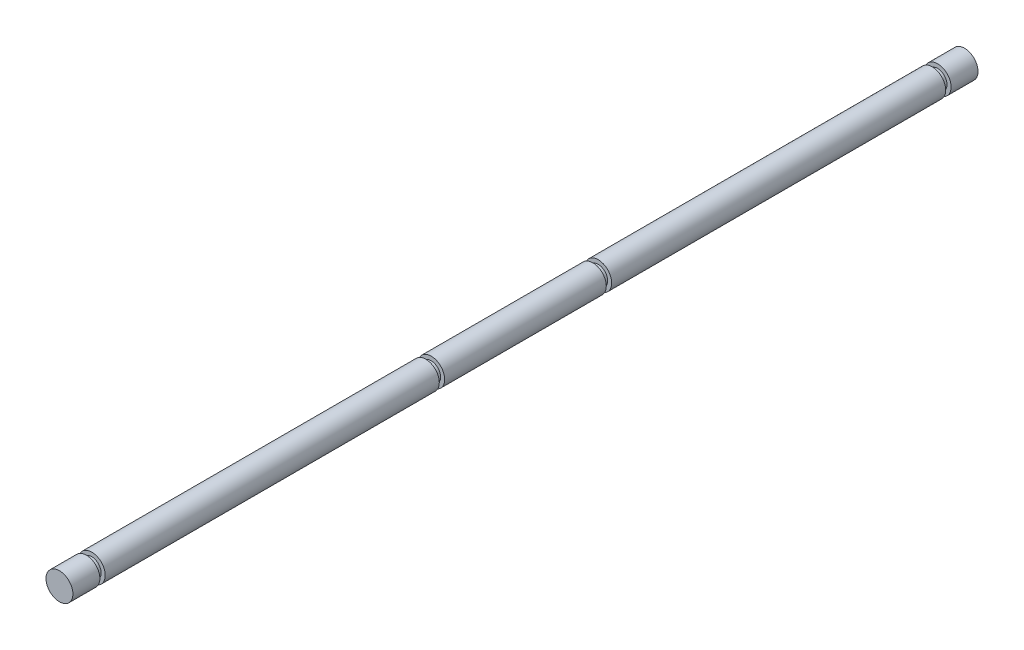
ISO-10303-21;
HEADER;
FILE_DESCRIPTION(('STEP AP214'),'2;1');
FILE_NAME('part.step','',(''),(''),'','','');
FILE_SCHEMA(('AUTOMOTIVE_DESIGN { 1 0 10303 214 1 1 1 1 }'));
ENDSEC;
DATA;
#1=APPLICATION_CONTEXT('core data for automotive mechanical design processes');
#2=APPLICATION_PROTOCOL_DEFINITION('international standard','automotive_design',2000,#1);
#3=PRODUCT_CONTEXT('',#1,'mechanical');
#4=PRODUCT('Part','Part','',(#3));
#5=PRODUCT_RELATED_PRODUCT_CATEGORY('part','',(#4));
#6=PRODUCT_DEFINITION_FORMATION('','',#4);
#7=PRODUCT_DEFINITION_CONTEXT('part definition',#1,'design');
#8=PRODUCT_DEFINITION('design','',#6,#7);
#9=PRODUCT_DEFINITION_SHAPE('','',#8);
#10=(LENGTH_UNIT() NAMED_UNIT(*) SI_UNIT(.MILLI.,.METRE.));
#11=(NAMED_UNIT(*) PLANE_ANGLE_UNIT() SI_UNIT($,.RADIAN.));
#12=(NAMED_UNIT(*) SI_UNIT($,.STERADIAN.) SOLID_ANGLE_UNIT());
#13=UNCERTAINTY_MEASURE_WITH_UNIT(LENGTH_MEASURE(1.E-05),#10,'distance_accuracy_value','');
#14=(GEOMETRIC_REPRESENTATION_CONTEXT(3) GLOBAL_UNCERTAINTY_ASSIGNED_CONTEXT((#13)) GLOBAL_UNIT_ASSIGNED_CONTEXT((#10,
#11,#12)) REPRESENTATION_CONTEXT('',''));
#15=CARTESIAN_POINT('',(0.,0.,0.));
#16=DIRECTION('',(0.,0.,1.));
#17=DIRECTION('',(1.,0.,0.));
#18=AXIS2_PLACEMENT_3D('',#15,#16,#17);
#19=CARTESIAN_POINT('',(0.,0.,60.));
#20=DIRECTION('',(0.,0.,-1.));
#21=DIRECTION('',(-1.,0.,0.));
#22=AXIS2_PLACEMENT_3D('',#19,#20,#21);
#23=CYLINDRICAL_SURFACE('',#22,5.);
#24=CARTESIAN_POINT('',(0.,0.,60.));
#25=DIRECTION('',(0.,0.,1.));
#26=DIRECTION('',(1.,0.,0.));
#27=AXIS2_PLACEMENT_3D('',#24,#25,#26);
#28=CIRCLE('',#27,5.);
#29=CARTESIAN_POINT('',(5.,0.,60.));
#30=VERTEX_POINT('',#29);
#31=EDGE_CURVE('E83',#30,#30,#28,.T.);
#32=ORIENTED_EDGE('',*,*,#31,.F.);
#33=EDGE_LOOP('',(#32));
#34=FACE_BOUND('',#33,.T.);
#35=CARTESIAN_POINT('',(0.,0.,0.));
#36=DIRECTION('',(0.,0.,1.));
#37=DIRECTION('',(1.,0.,0.));
#38=AXIS2_PLACEMENT_3D('',#35,#36,#37);
#39=CIRCLE('',#38,5.);
#40=CARTESIAN_POINT('',(5.,0.,0.));
#41=VERTEX_POINT('',#40);
#42=EDGE_CURVE('E37',#41,#41,#39,.T.);
#43=ORIENTED_EDGE('',*,*,#42,.T.);
#44=EDGE_LOOP('',(#43));
#45=FACE_BOUND('',#44,.T.);
#46=ADVANCED_FACE('F34',(#34,#45),#23,.T.);
#47=CARTESIAN_POINT('',(0.,0.,60.));
#48=DIRECTION('',(0.,0.,1.));
#49=DIRECTION('',(1.,0.,0.));
#50=AXIS2_PLACEMENT_3D('',#47,#48,#49);
#51=PLANE('',#50);
#52=CARTESIAN_POINT('',(0.,0.,60.));
#53=DIRECTION('',(0.,0.,1.));
#54=DIRECTION('',(1.,0.,0.));
#55=AXIS2_PLACEMENT_3D('',#52,#53,#54);
#56=CIRCLE('',#55,3.5);
#57=CARTESIAN_POINT('',(3.5,0.,60.));
#58=VERTEX_POINT('',#57);
#59=EDGE_CURVE('E79',#58,#58,#56,.T.);
#60=ORIENTED_EDGE('',*,*,#59,.F.);
#61=EDGE_LOOP('',(#60));
#62=FACE_BOUND('',#61,.T.);
#63=ORIENTED_EDGE('',*,*,#31,.T.);
#64=EDGE_LOOP('',(#63));
#65=FACE_BOUND('',#64,.T.);
#66=ADVANCED_FACE('F94',(#62,#65),#51,.T.);
#67=CARTESIAN_POINT('',(0.,0.,0.));
#68=DIRECTION('',(0.,0.,1.));
#69=DIRECTION('',(1.,0.,0.));
#70=AXIS2_PLACEMENT_3D('',#67,#68,#69);
#71=PLANE('',#70);
#72=CARTESIAN_POINT('',(0.,0.,0.));
#73=DIRECTION('',(0.,0.,-1.));
#74=DIRECTION('',(-1.,0.,0.));
#75=AXIS2_PLACEMENT_3D('',#72,#73,#74);
#76=CIRCLE('',#75,3.5);
#77=CARTESIAN_POINT('',(-3.5,0.,0.));
#78=VERTEX_POINT('',#77);
#79=EDGE_CURVE('E46',#78,#78,#76,.T.);
#80=ORIENTED_EDGE('',*,*,#79,.F.);
#81=EDGE_LOOP('',(#80));
#82=FACE_BOUND('',#81,.T.);
#83=ORIENTED_EDGE('',*,*,#42,.F.);
#84=EDGE_LOOP('',(#83));
#85=FACE_BOUND('',#84,.T.);
#86=ADVANCED_FACE('F91',(#82,#85),#71,.F.);
#87=CARTESIAN_POINT('',(0.,0.,62.));
#88=DIRECTION('',(0.,0.,-1.));
#89=DIRECTION('',(-1.,0.,0.));
#90=AXIS2_PLACEMENT_3D('',#87,#88,#89);
#91=CYLINDRICAL_SURFACE('',#90,3.5);
#92=CARTESIAN_POINT('',(0.,0.,62.));
#93=DIRECTION('',(0.,0.,1.));
#94=DIRECTION('',(1.,0.,0.));
#95=AXIS2_PLACEMENT_3D('',#92,#93,#94);
#96=CIRCLE('',#95,3.5);
#97=CARTESIAN_POINT('',(3.5,0.,62.));
#98=VERTEX_POINT('',#97);
#99=EDGE_CURVE('E76',#98,#98,#96,.T.);
#100=ORIENTED_EDGE('',*,*,#99,.F.);
#101=EDGE_LOOP('',(#100));
#102=FACE_BOUND('',#101,.T.);
#103=ORIENTED_EDGE('',*,*,#59,.T.);
#104=EDGE_LOOP('',(#103));
#105=FACE_BOUND('',#104,.T.);
#106=ADVANCED_FACE('F93',(#102,#105),#91,.T.);
#107=CARTESIAN_POINT('',(0.,0.,-2.));
#108=DIRECTION('',(0.,0.,1.));
#109=DIRECTION('',(1.,0.,0.));
#110=AXIS2_PLACEMENT_3D('',#107,#108,#109);
#111=CYLINDRICAL_SURFACE('',#110,3.5);
#112=CARTESIAN_POINT('',(0.,0.,-2.));
#113=DIRECTION('',(0.,0.,-1.));
#114=DIRECTION('',(-1.,0.,0.));
#115=AXIS2_PLACEMENT_3D('',#112,#113,#114);
#116=CIRCLE('',#115,3.5);
#117=CARTESIAN_POINT('',(-3.5,0.,-2.));
#118=VERTEX_POINT('',#117);
#119=EDGE_CURVE('E71',#118,#118,#116,.T.);
#120=ORIENTED_EDGE('',*,*,#119,.F.);
#121=EDGE_LOOP('',(#120));
#122=FACE_BOUND('',#121,.T.);
#123=ORIENTED_EDGE('',*,*,#79,.T.);
#124=EDGE_LOOP('',(#123));
#125=FACE_BOUND('',#124,.T.);
#126=ADVANCED_FACE('F100',(#122,#125),#111,.T.);
#127=CARTESIAN_POINT('',(0.,0.,-126.));
#128=DIRECTION('',(0.,0.,1.));
#129=DIRECTION('',(1.,0.,0.));
#130=AXIS2_PLACEMENT_3D('',#127,#128,#129);
#131=CYLINDRICAL_SURFACE('',#130,5.);
#132=CARTESIAN_POINT('',(0.,0.,-126.));
#133=DIRECTION('',(0.,0.,-1.));
#134=DIRECTION('',(-1.,0.,0.));
#135=AXIS2_PLACEMENT_3D('',#132,#133,#134);
#136=CIRCLE('',#135,5.);
#137=CARTESIAN_POINT('',(-5.,0.,-126.));
#138=VERTEX_POINT('',#137);
#139=EDGE_CURVE('E68',#138,#138,#136,.T.);
#140=ORIENTED_EDGE('',*,*,#139,.F.);
#141=EDGE_LOOP('',(#140));
#142=FACE_BOUND('',#141,.T.);
#143=CARTESIAN_POINT('',(0.,0.,-2.));
#144=DIRECTION('',(0.,0.,-1.));
#145=DIRECTION('',(-1.,0.,0.));
#146=AXIS2_PLACEMENT_3D('',#143,#144,#145);
#147=CIRCLE('',#146,5.);
#148=CARTESIAN_POINT('',(-5.,0.,-2.));
#149=VERTEX_POINT('',#148);
#150=EDGE_CURVE('E65',#149,#149,#147,.T.);
#151=ORIENTED_EDGE('',*,*,#150,.T.);
#152=EDGE_LOOP('',(#151));
#153=FACE_BOUND('',#152,.T.);
#154=ADVANCED_FACE('F133',(#142,#153),#131,.T.);
#155=CARTESIAN_POINT('',(0.,0.,-126.));
#156=DIRECTION('',(0.,0.,-1.));
#157=DIRECTION('',(-1.,0.,0.));
#158=AXIS2_PLACEMENT_3D('',#155,#156,#157);
#159=PLANE('',#158);
#160=CARTESIAN_POINT('',(0.,0.,-126.));
#161=DIRECTION('',(0.,0.,-1.));
#162=DIRECTION('',(-1.,0.,0.));
#163=AXIS2_PLACEMENT_3D('',#160,#161,#162);
#164=CIRCLE('',#163,3.5);
#165=CARTESIAN_POINT('',(-3.5,0.,-126.));
#166=VERTEX_POINT('',#165);
#167=EDGE_CURVE('E10',#166,#166,#164,.T.);
#168=ORIENTED_EDGE('',*,*,#167,.F.);
#169=EDGE_LOOP('',(#168));
#170=FACE_BOUND('',#169,.T.);
#171=ORIENTED_EDGE('',*,*,#139,.T.);
#172=EDGE_LOOP('',(#171));
#173=FACE_BOUND('',#172,.T.);
#174=ADVANCED_FACE('F143',(#170,#173),#159,.T.);
#175=CARTESIAN_POINT('',(0.,0.,-2.));
#176=DIRECTION('',(0.,0.,-1.));
#177=DIRECTION('',(-1.,0.,0.));
#178=AXIS2_PLACEMENT_3D('',#175,#176,#177);
#179=PLANE('',#178);
#180=ORIENTED_EDGE('',*,*,#119,.T.);
#181=EDGE_LOOP('',(#180));
#182=FACE_BOUND('',#181,.T.);
#183=ORIENTED_EDGE('',*,*,#150,.F.);
#184=EDGE_LOOP('',(#183));
#185=FACE_BOUND('',#184,.T.);
#186=ADVANCED_FACE('F151',(#182,#185),#179,.F.);
#187=CARTESIAN_POINT('',(0.,0.,186.));
#188=DIRECTION('',(0.,0.,-1.));
#189=DIRECTION('',(-1.,0.,0.));
#190=AXIS2_PLACEMENT_3D('',#187,#188,#189);
#191=CYLINDRICAL_SURFACE('',#190,5.);
#192=CARTESIAN_POINT('',(0.,0.,186.));
#193=DIRECTION('',(0.,0.,1.));
#194=DIRECTION('',(1.,0.,0.));
#195=AXIS2_PLACEMENT_3D('',#192,#193,#194);
#196=CIRCLE('',#195,5.);
#197=CARTESIAN_POINT('',(5.,0.,186.));
#198=VERTEX_POINT('',#197);
#199=EDGE_CURVE('E62',#198,#198,#196,.T.);
#200=ORIENTED_EDGE('',*,*,#199,.F.);
#201=EDGE_LOOP('',(#200));
#202=FACE_BOUND('',#201,.T.);
#203=CARTESIAN_POINT('',(0.,0.,62.));
#204=DIRECTION('',(0.,0.,1.));
#205=DIRECTION('',(1.,0.,0.));
#206=AXIS2_PLACEMENT_3D('',#203,#204,#205);
#207=CIRCLE('',#206,5.);
#208=CARTESIAN_POINT('',(5.,0.,62.));
#209=VERTEX_POINT('',#208);
#210=EDGE_CURVE('E60',#209,#209,#207,.T.);
#211=ORIENTED_EDGE('',*,*,#210,.T.);
#212=EDGE_LOOP('',(#211));
#213=FACE_BOUND('',#212,.T.);
#214=ADVANCED_FACE('F156',(#202,#213),#191,.T.);
#215=CARTESIAN_POINT('',(0.,0.,186.));
#216=DIRECTION('',(0.,0.,1.));
#217=DIRECTION('',(1.,0.,0.));
#218=AXIS2_PLACEMENT_3D('',#215,#216,#217);
#219=PLANE('',#218);
#220=CARTESIAN_POINT('',(0.,0.,186.));
#221=DIRECTION('',(0.,0.,1.));
#222=DIRECTION('',(1.,0.,0.));
#223=AXIS2_PLACEMENT_3D('',#220,#221,#222);
#224=CIRCLE('',#223,3.5);
#225=CARTESIAN_POINT('',(3.5,0.,186.));
#226=VERTEX_POINT('',#225);
#227=EDGE_CURVE('E41',#226,#226,#224,.T.);
#228=ORIENTED_EDGE('',*,*,#227,.F.);
#229=EDGE_LOOP('',(#228));
#230=FACE_BOUND('',#229,.T.);
#231=ORIENTED_EDGE('',*,*,#199,.T.);
#232=EDGE_LOOP('',(#231));
#233=FACE_BOUND('',#232,.T.);
#234=ADVANCED_FACE('F166',(#230,#233),#219,.T.);
#235=CARTESIAN_POINT('',(0.,0.,62.));
#236=DIRECTION('',(0.,0.,1.));
#237=DIRECTION('',(1.,0.,0.));
#238=AXIS2_PLACEMENT_3D('',#235,#236,#237);
#239=PLANE('',#238);
#240=ORIENTED_EDGE('',*,*,#99,.T.);
#241=EDGE_LOOP('',(#240));
#242=FACE_BOUND('',#241,.T.);
#243=ORIENTED_EDGE('',*,*,#210,.F.);
#244=EDGE_LOOP('',(#243));
#245=FACE_BOUND('',#244,.T.);
#246=ADVANCED_FACE('F174',(#242,#245),#239,.F.);
#247=CARTESIAN_POINT('',(0.,0.,188.));
#248=DIRECTION('',(0.,0.,-1.));
#249=DIRECTION('',(-1.,0.,0.));
#250=AXIS2_PLACEMENT_3D('',#247,#248,#249);
#251=CYLINDRICAL_SURFACE('',#250,3.5);
#252=CARTESIAN_POINT('',(0.,0.,188.));
#253=DIRECTION('',(0.,0.,1.));
#254=DIRECTION('',(1.,0.,0.));
#255=AXIS2_PLACEMENT_3D('',#252,#253,#254);
#256=CIRCLE('',#255,3.5);
#257=CARTESIAN_POINT('',(3.5,0.,188.));
#258=VERTEX_POINT('',#257);
#259=EDGE_CURVE('E55',#258,#258,#256,.T.);
#260=ORIENTED_EDGE('',*,*,#259,.F.);
#261=EDGE_LOOP('',(#260));
#262=FACE_BOUND('',#261,.T.);
#263=ORIENTED_EDGE('',*,*,#227,.T.);
#264=EDGE_LOOP('',(#263));
#265=FACE_BOUND('',#264,.T.);
#266=ADVANCED_FACE('F179',(#262,#265),#251,.T.);
#267=CARTESIAN_POINT('',(0.,0.,198.));
#268=DIRECTION('',(0.,0.,-1.));
#269=DIRECTION('',(-1.,0.,0.));
#270=AXIS2_PLACEMENT_3D('',#267,#268,#269);
#271=CYLINDRICAL_SURFACE('',#270,5.);
#272=CARTESIAN_POINT('',(0.,0.,198.));
#273=DIRECTION('',(0.,0.,1.));
#274=DIRECTION('',(1.,0.,0.));
#275=AXIS2_PLACEMENT_3D('',#272,#273,#274);
#276=CIRCLE('',#275,5.);
#277=CARTESIAN_POINT('',(5.,0.,198.));
#278=VERTEX_POINT('',#277);
#279=EDGE_CURVE('E52',#278,#278,#276,.T.);
#280=ORIENTED_EDGE('',*,*,#279,.F.);
#281=EDGE_LOOP('',(#280));
#282=FACE_BOUND('',#281,.T.);
#283=CARTESIAN_POINT('',(0.,0.,188.));
#284=DIRECTION('',(0.,0.,1.));
#285=DIRECTION('',(1.,0.,0.));
#286=AXIS2_PLACEMENT_3D('',#283,#284,#285);
#287=CIRCLE('',#286,5.);
#288=CARTESIAN_POINT('',(5.,0.,188.));
#289=VERTEX_POINT('',#288);
#290=EDGE_CURVE('E56',#289,#289,#287,.T.);
#291=ORIENTED_EDGE('',*,*,#290,.T.);
#292=EDGE_LOOP('',(#291));
#293=FACE_BOUND('',#292,.T.);
#294=ADVANCED_FACE('F196',(#282,#293),#271,.T.);
#295=CARTESIAN_POINT('',(0.,0.,198.));
#296=DIRECTION('',(0.,0.,1.));
#297=DIRECTION('',(1.,0.,0.));
#298=AXIS2_PLACEMENT_3D('',#295,#296,#297);
#299=PLANE('',#298);
#300=ORIENTED_EDGE('',*,*,#279,.T.);
#301=EDGE_LOOP('',(#300));
#302=FACE_BOUND('',#301,.T.);
#303=ADVANCED_FACE('F206',(#302),#299,.T.);
#304=CARTESIAN_POINT('',(0.,0.,188.));
#305=DIRECTION('',(0.,0.,1.));
#306=DIRECTION('',(1.,0.,0.));
#307=AXIS2_PLACEMENT_3D('',#304,#305,#306);
#308=PLANE('',#307);
#309=ORIENTED_EDGE('',*,*,#259,.T.);
#310=EDGE_LOOP('',(#309));
#311=FACE_BOUND('',#310,.T.);
#312=ORIENTED_EDGE('',*,*,#290,.F.);
#313=EDGE_LOOP('',(#312));
#314=FACE_BOUND('',#313,.T.);
#315=ADVANCED_FACE('F216',(#311,#314),#308,.F.);
#316=CARTESIAN_POINT('',(0.,0.,-128.));
#317=DIRECTION('',(0.,0.,1.));
#318=DIRECTION('',(1.,0.,0.));
#319=AXIS2_PLACEMENT_3D('',#316,#317,#318);
#320=CYLINDRICAL_SURFACE('',#319,3.5);
#321=CARTESIAN_POINT('',(0.,0.,-128.));
#322=DIRECTION('',(0.,0.,-1.));
#323=DIRECTION('',(-1.,0.,0.));
#324=AXIS2_PLACEMENT_3D('',#321,#322,#323);
#325=CIRCLE('',#324,3.5);
#326=CARTESIAN_POINT('',(-3.5,0.,-128.));
#327=VERTEX_POINT('',#326);
#328=EDGE_CURVE('E50',#327,#327,#325,.T.);
#329=ORIENTED_EDGE('',*,*,#328,.F.);
#330=EDGE_LOOP('',(#329));
#331=FACE_BOUND('',#330,.T.);
#332=ORIENTED_EDGE('',*,*,#167,.T.);
#333=EDGE_LOOP('',(#332));
#334=FACE_BOUND('',#333,.T.);
#335=ADVANCED_FACE('F226',(#331,#334),#320,.T.);
#336=CARTESIAN_POINT('',(0.,0.,-138.));
#337=DIRECTION('',(0.,0.,1.));
#338=DIRECTION('',(1.,0.,0.));
#339=AXIS2_PLACEMENT_3D('',#336,#337,#338);
#340=CYLINDRICAL_SURFACE('',#339,5.);
#341=CARTESIAN_POINT('',(0.,0.,-138.));
#342=DIRECTION('',(0.,0.,-1.));
#343=DIRECTION('',(-1.,0.,0.));
#344=AXIS2_PLACEMENT_3D('',#341,#342,#343);
#345=CIRCLE('',#344,5.);
#346=CARTESIAN_POINT('',(-5.,0.,-138.));
#347=VERTEX_POINT('',#346);
#348=EDGE_CURVE('E284',#347,#347,#345,.T.);
#349=ORIENTED_EDGE('',*,*,#348,.F.);
#350=EDGE_LOOP('',(#349));
#351=FACE_BOUND('',#350,.T.);
#352=CARTESIAN_POINT('',(0.,0.,-128.));
#353=DIRECTION('',(0.,0.,-1.));
#354=DIRECTION('',(-1.,0.,0.));
#355=AXIS2_PLACEMENT_3D('',#352,#353,#354);
#356=CIRCLE('',#355,5.);
#357=CARTESIAN_POINT('',(-5.,0.,-128.));
#358=VERTEX_POINT('',#357);
#359=EDGE_CURVE('E282',#358,#358,#356,.T.);
#360=ORIENTED_EDGE('',*,*,#359,.T.);
#361=EDGE_LOOP('',(#360));
#362=FACE_BOUND('',#361,.T.);
#363=ADVANCED_FACE('F243',(#351,#362),#340,.T.);
#364=CARTESIAN_POINT('',(0.,0.,-138.));
#365=DIRECTION('',(0.,0.,-1.));
#366=DIRECTION('',(-1.,0.,0.));
#367=AXIS2_PLACEMENT_3D('',#364,#365,#366);
#368=PLANE('',#367);
#369=ORIENTED_EDGE('',*,*,#348,.T.);
#370=EDGE_LOOP('',(#369));
#371=FACE_BOUND('',#370,.T.);
#372=ADVANCED_FACE('F253',(#371),#368,.T.);
#373=CARTESIAN_POINT('',(0.,0.,-128.));
#374=DIRECTION('',(0.,0.,-1.));
#375=DIRECTION('',(-1.,0.,0.));
#376=AXIS2_PLACEMENT_3D('',#373,#374,#375);
#377=PLANE('',#376);
#378=ORIENTED_EDGE('',*,*,#328,.T.);
#379=EDGE_LOOP('',(#378));
#380=FACE_BOUND('',#379,.T.);
#381=ORIENTED_EDGE('',*,*,#359,.F.);
#382=EDGE_LOOP('',(#381));
#383=FACE_BOUND('',#382,.T.);
#384=ADVANCED_FACE('F263',(#380,#383),#377,.F.);
#385=CLOSED_SHELL('',(#46,#66,#86,#106,#126,#154,#174,#186,#214,#234,#246,#266,#294,#303,#315,
#335,#363,#372,#384));
#386=MANIFOLD_SOLID_BREP('B2',#385);
#387=ADVANCED_BREP_SHAPE_REPRESENTATION('',(#18,#386),#14);
#388=SHAPE_DEFINITION_REPRESENTATION(#9,#387);
ENDSEC;
END-ISO-10303-21;
